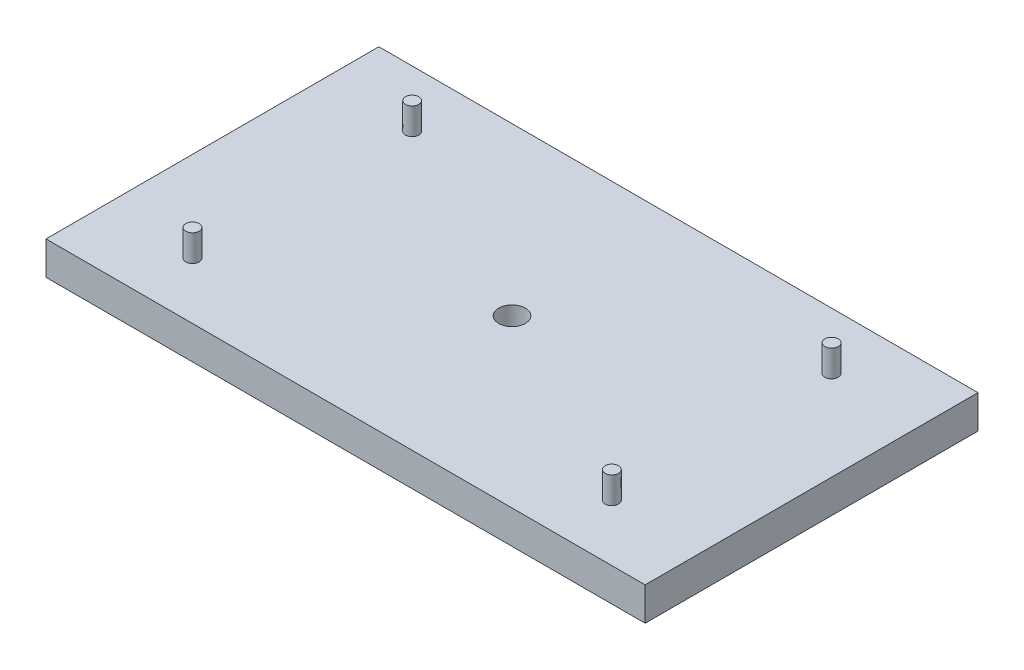
ISO-10303-21;
HEADER;
FILE_DESCRIPTION(('STEP AP214'),'2;1');
FILE_NAME('part.step','',(''),(''),'','','');
FILE_SCHEMA(('AUTOMOTIVE_DESIGN { 1 0 10303 214 1 1 1 1 }'));
ENDSEC;
DATA;
#1=APPLICATION_CONTEXT('core data for automotive mechanical design processes');
#2=APPLICATION_PROTOCOL_DEFINITION('international standard','automotive_design',2000,#1);
#3=PRODUCT_CONTEXT('',#1,'mechanical');
#4=PRODUCT('Part','Part','',(#3));
#5=PRODUCT_RELATED_PRODUCT_CATEGORY('part','',(#4));
#6=PRODUCT_DEFINITION_FORMATION('','',#4);
#7=PRODUCT_DEFINITION_CONTEXT('part definition',#1,'design');
#8=PRODUCT_DEFINITION('design','',#6,#7);
#9=PRODUCT_DEFINITION_SHAPE('','',#8);
#10=(LENGTH_UNIT() NAMED_UNIT(*) SI_UNIT(.MILLI.,.METRE.));
#11=(NAMED_UNIT(*) PLANE_ANGLE_UNIT() SI_UNIT($,.RADIAN.));
#12=(NAMED_UNIT(*) SI_UNIT($,.STERADIAN.) SOLID_ANGLE_UNIT());
#13=UNCERTAINTY_MEASURE_WITH_UNIT(LENGTH_MEASURE(1.E-05),#10,'distance_accuracy_value','');
#14=(GEOMETRIC_REPRESENTATION_CONTEXT(3) GLOBAL_UNCERTAINTY_ASSIGNED_CONTEXT((#13)) GLOBAL_UNIT_ASSIGNED_CONTEXT((#10,
#11,#12)) REPRESENTATION_CONTEXT('',''));
#15=CARTESIAN_POINT('',(0.,0.,0.));
#16=DIRECTION('',(0.,0.,1.));
#17=DIRECTION('',(1.,0.,0.));
#18=AXIS2_PLACEMENT_3D('',#15,#16,#17);
#19=CARTESIAN_POINT('',(-68.5629921259842,5.,-63.9566929133858));
#20=DIRECTION('',(-1.,0.,0.));
#21=DIRECTION('',(0.,0.,1.));
#22=AXIS2_PLACEMENT_3D('',#19,#20,#21);
#23=PLANE('',#22);
#24=DIRECTION('',(0.,0.,-1.));
#25=VECTOR('',#24,1.);
#26=CARTESIAN_POINT('',(-68.5629921259842,0.,-63.9566929133858));
#27=LINE('',#26,#25);
#28=CARTESIAN_POINT('',(-68.5629921259842,0.,-13.9566929133858));
#29=VERTEX_POINT('',#28);
#30=CARTESIAN_POINT('',(-68.5629921259842,0.,-63.9566929133858));
#31=VERTEX_POINT('',#30);
#32=EDGE_CURVE('E102',#29,#31,#27,.T.);
#33=ORIENTED_EDGE('',*,*,#32,.T.);
#34=DIRECTION('',(0.,-1.,0.));
#35=VECTOR('',#34,1.);
#36=CARTESIAN_POINT('',(-68.5629921259842,5.,-63.9566929133858));
#37=LINE('',#36,#35);
#38=CARTESIAN_POINT('',(-68.5629921259842,5.,-63.9566929133858));
#39=VERTEX_POINT('',#38);
#40=EDGE_CURVE('E11',#39,#31,#37,.T.);
#41=ORIENTED_EDGE('',*,*,#40,.F.);
#42=DIRECTION('',(0.,0.,-1.));
#43=VECTOR('',#42,1.);
#44=CARTESIAN_POINT('',(-68.5629921259842,5.,-63.9566929133858));
#45=LINE('',#44,#43);
#46=CARTESIAN_POINT('',(-68.5629921259842,5.,-13.9566929133858));
#47=VERTEX_POINT('',#46);
#48=EDGE_CURVE('E90',#47,#39,#45,.T.);
#49=ORIENTED_EDGE('',*,*,#48,.F.);
#50=DIRECTION('',(0.,-1.,0.));
#51=VECTOR('',#50,1.);
#52=CARTESIAN_POINT('',(-68.5629921259842,5.,-13.9566929133858));
#53=LINE('',#52,#51);
#54=EDGE_CURVE('E98',#47,#29,#53,.T.);
#55=ORIENTED_EDGE('',*,*,#54,.T.);
#56=EDGE_LOOP('',(#33,#41,#49,#55));
#57=FACE_BOUND('',#56,.T.);
#58=ADVANCED_FACE('F39',(#57),#23,.F.);
#59=CARTESIAN_POINT('',(-158.562992125984,5.,-63.9566929133858));
#60=DIRECTION('',(0.,0.,1.));
#61=DIRECTION('',(1.,0.,0.));
#62=AXIS2_PLACEMENT_3D('',#59,#60,#61);
#63=PLANE('',#62);
#64=DIRECTION('',(-1.,0.,0.));
#65=VECTOR('',#64,1.);
#66=CARTESIAN_POINT('',(-158.562992125984,0.,-63.9566929133858));
#67=LINE('',#66,#65);
#68=CARTESIAN_POINT('',(-158.562992125984,0.,-63.9566929133858));
#69=VERTEX_POINT('',#68);
#70=EDGE_CURVE('E94',#31,#69,#67,.T.);
#71=ORIENTED_EDGE('',*,*,#70,.T.);
#72=DIRECTION('',(0.,-1.,0.));
#73=VECTOR('',#72,1.);
#74=CARTESIAN_POINT('',(-158.562992125984,5.,-63.9566929133858));
#75=LINE('',#74,#73);
#76=CARTESIAN_POINT('',(-158.562992125984,5.,-63.9566929133858));
#77=VERTEX_POINT('',#76);
#78=EDGE_CURVE('E47',#77,#69,#75,.T.);
#79=ORIENTED_EDGE('',*,*,#78,.F.);
#80=DIRECTION('',(-1.,0.,0.));
#81=VECTOR('',#80,1.);
#82=CARTESIAN_POINT('',(-158.562992125984,5.,-63.9566929133858));
#83=LINE('',#82,#81);
#84=EDGE_CURVE('E85',#39,#77,#83,.T.);
#85=ORIENTED_EDGE('',*,*,#84,.F.);
#86=ORIENTED_EDGE('',*,*,#40,.T.);
#87=EDGE_LOOP('',(#71,#79,#85,#86));
#88=FACE_BOUND('',#87,.T.);
#89=ADVANCED_FACE('F93',(#88),#63,.F.);
#90=CARTESIAN_POINT('',(-158.562992125984,5.,-63.9566929133858));
#91=DIRECTION('',(1.,0.,0.));
#92=DIRECTION('',(0.,0.,-1.));
#93=AXIS2_PLACEMENT_3D('',#90,#91,#92);
#94=PLANE('',#93);
#95=DIRECTION('',(0.,0.,1.));
#96=VECTOR('',#95,1.);
#97=CARTESIAN_POINT('',(-158.562992125984,0.,-63.9566929133858));
#98=LINE('',#97,#96);
#99=CARTESIAN_POINT('',(-158.562992125984,0.,-13.9566929133858));
#100=VERTEX_POINT('',#99);
#101=EDGE_CURVE('E72',#69,#100,#98,.T.);
#102=ORIENTED_EDGE('',*,*,#101,.T.);
#103=DIRECTION('',(0.,-1.,0.));
#104=VECTOR('',#103,1.);
#105=CARTESIAN_POINT('',(-158.562992125984,5.,-13.9566929133858));
#106=LINE('',#105,#104);
#107=CARTESIAN_POINT('',(-158.562992125984,5.,-13.9566929133858));
#108=VERTEX_POINT('',#107);
#109=EDGE_CURVE('E95',#108,#100,#106,.T.);
#110=ORIENTED_EDGE('',*,*,#109,.F.);
#111=DIRECTION('',(0.,0.,1.));
#112=VECTOR('',#111,1.);
#113=CARTESIAN_POINT('',(-158.562992125984,5.,-63.9566929133858));
#114=LINE('',#113,#112);
#115=EDGE_CURVE('E88',#77,#108,#114,.T.);
#116=ORIENTED_EDGE('',*,*,#115,.F.);
#117=ORIENTED_EDGE('',*,*,#78,.T.);
#118=EDGE_LOOP('',(#102,#110,#116,#117));
#119=FACE_BOUND('',#118,.T.);
#120=ADVANCED_FACE('F96',(#119),#94,.F.);
#121=CARTESIAN_POINT('',(-158.562992125984,5.,-13.9566929133858));
#122=DIRECTION('',(0.,0.,-1.));
#123=DIRECTION('',(-1.,0.,0.));
#124=AXIS2_PLACEMENT_3D('',#121,#122,#123);
#125=PLANE('',#124);
#126=DIRECTION('',(1.,0.,0.));
#127=VECTOR('',#126,1.);
#128=CARTESIAN_POINT('',(-158.562992125984,0.,-13.9566929133858));
#129=LINE('',#128,#127);
#130=EDGE_CURVE('E78',#100,#29,#129,.T.);
#131=ORIENTED_EDGE('',*,*,#130,.T.);
#132=ORIENTED_EDGE('',*,*,#54,.F.);
#133=DIRECTION('',(1.,0.,0.));
#134=VECTOR('',#133,1.);
#135=CARTESIAN_POINT('',(-158.562992125984,5.,-13.9566929133858));
#136=LINE('',#135,#134);
#137=EDGE_CURVE('E55',#108,#47,#136,.T.);
#138=ORIENTED_EDGE('',*,*,#137,.F.);
#139=ORIENTED_EDGE('',*,*,#109,.T.);
#140=EDGE_LOOP('',(#131,#132,#138,#139));
#141=FACE_BOUND('',#140,.T.);
#142=ADVANCED_FACE('F110',(#141),#125,.F.);
#143=CARTESIAN_POINT('',(0.,5.,0.));
#144=DIRECTION('',(0.,1.,0.));
#145=DIRECTION('',(0.,0.,1.));
#146=AXIS2_PLACEMENT_3D('',#143,#144,#145);
#147=PLANE('',#146);
#148=CARTESIAN_POINT('',(-113.562992125984,5.,-38.9566929133858));
#149=DIRECTION('',(0.,1.,0.));
#150=DIRECTION('',(0.,0.,1.));
#151=AXIS2_PLACEMENT_3D('',#148,#149,#150);
#152=CIRCLE('',#151,1.99999999999999);
#153=CARTESIAN_POINT('',(-113.562992125984,5.,-36.9566929133858));
#154=VERTEX_POINT('',#153);
#155=EDGE_CURVE('E137',#154,#154,#152,.T.);
#156=ORIENTED_EDGE('',*,*,#155,.F.);
#157=EDGE_LOOP('',(#156));
#158=FACE_BOUND('',#157,.T.);
#159=CARTESIAN_POINT('',(-82.0629921259842,5.,-22.4566929133853));
#160=DIRECTION('',(0.,1.,0.));
#161=DIRECTION('',(0.,0.,1.));
#162=AXIS2_PLACEMENT_3D('',#159,#160,#161);
#163=CIRCLE('',#162,0.999999999999998);
#164=CARTESIAN_POINT('',(-82.0629921259842,5.,-21.4566929133853));
#165=VERTEX_POINT('',#164);
#166=EDGE_CURVE('E131',#165,#165,#163,.T.);
#167=ORIENTED_EDGE('',*,*,#166,.F.);
#168=EDGE_LOOP('',(#167));
#169=FACE_BOUND('',#168,.T.);
#170=CARTESIAN_POINT('',(-82.0629921259842,5.,-55.4566929133858));
#171=DIRECTION('',(0.,1.,0.));
#172=DIRECTION('',(0.,0.,1.));
#173=AXIS2_PLACEMENT_3D('',#170,#171,#172);
#174=CIRCLE('',#173,0.999999999999998);
#175=CARTESIAN_POINT('',(-82.0629921259842,5.,-54.4566929133858));
#176=VERTEX_POINT('',#175);
#177=EDGE_CURVE('E125',#176,#176,#174,.T.);
#178=ORIENTED_EDGE('',*,*,#177,.F.);
#179=EDGE_LOOP('',(#178));
#180=FACE_BOUND('',#179,.T.);
#181=CARTESIAN_POINT('',(-145.062992125984,5.,-55.4566929133858));
#182=DIRECTION('',(0.,1.,0.));
#183=DIRECTION('',(0.,0.,1.));
#184=AXIS2_PLACEMENT_3D('',#181,#182,#183);
#185=CIRCLE('',#184,0.999999999999998);
#186=CARTESIAN_POINT('',(-145.062992125984,5.,-54.4566929133858));
#187=VERTEX_POINT('',#186);
#188=EDGE_CURVE('E119',#187,#187,#185,.T.);
#189=ORIENTED_EDGE('',*,*,#188,.F.);
#190=EDGE_LOOP('',(#189));
#191=FACE_BOUND('',#190,.T.);
#192=CARTESIAN_POINT('',(-145.062992125984,5.,-22.4566929133858));
#193=DIRECTION('',(0.,1.,0.));
#194=DIRECTION('',(0.,0.,1.));
#195=AXIS2_PLACEMENT_3D('',#192,#193,#194);
#196=CIRCLE('',#195,0.999999999999998);
#197=CARTESIAN_POINT('',(-145.062992125984,5.,-21.4566929133858));
#198=VERTEX_POINT('',#197);
#199=EDGE_CURVE('E116',#198,#198,#196,.T.);
#200=ORIENTED_EDGE('',*,*,#199,.F.);
#201=EDGE_LOOP('',(#200));
#202=FACE_BOUND('',#201,.T.);
#203=ORIENTED_EDGE('',*,*,#48,.T.);
#204=ORIENTED_EDGE('',*,*,#84,.T.);
#205=ORIENTED_EDGE('',*,*,#115,.T.);
#206=ORIENTED_EDGE('',*,*,#137,.T.);
#207=EDGE_LOOP('',(#203,#204,#205,#206));
#208=FACE_BOUND('',#207,.T.);
#209=ADVANCED_FACE('F86',(#158,#169,#180,#191,#202,#208),#147,.T.);
#210=CARTESIAN_POINT('',(0.,0.,0.));
#211=DIRECTION('',(0.,1.,0.));
#212=DIRECTION('',(0.,0.,1.));
#213=AXIS2_PLACEMENT_3D('',#210,#211,#212);
#214=PLANE('',#213);
#215=CARTESIAN_POINT('',(-113.562992125984,0.,-38.9566929133858));
#216=DIRECTION('',(0.,-1.,0.));
#217=DIRECTION('',(0.,0.,-1.));
#218=AXIS2_PLACEMENT_3D('',#215,#216,#217);
#219=CIRCLE('',#218,1.99999999999999);
#220=CARTESIAN_POINT('',(-113.562992125984,0.,-40.9566929133858));
#221=VERTEX_POINT('',#220);
#222=EDGE_CURVE('E142',#221,#221,#219,.T.);
#223=ORIENTED_EDGE('',*,*,#222,.F.);
#224=EDGE_LOOP('',(#223));
#225=FACE_BOUND('',#224,.T.);
#226=ORIENTED_EDGE('',*,*,#32,.F.);
#227=ORIENTED_EDGE('',*,*,#130,.F.);
#228=ORIENTED_EDGE('',*,*,#101,.F.);
#229=ORIENTED_EDGE('',*,*,#70,.F.);
#230=EDGE_LOOP('',(#226,#227,#228,#229));
#231=FACE_BOUND('',#230,.T.);
#232=ADVANCED_FACE('F113',(#225,#231),#214,.F.);
#233=CARTESIAN_POINT('',(-145.062992125984,9.,-22.4566929133858));
#234=DIRECTION('',(0.,-1.,0.));
#235=DIRECTION('',(0.,0.,-1.));
#236=AXIS2_PLACEMENT_3D('',#233,#234,#235);
#237=CYLINDRICAL_SURFACE('',#236,0.999999999999998);
#238=CARTESIAN_POINT('',(-145.062992125984,9.,-22.4566929133858));
#239=DIRECTION('',(0.,1.,0.));
#240=DIRECTION('',(0.,0.,1.));
#241=AXIS2_PLACEMENT_3D('',#238,#239,#240);
#242=CIRCLE('',#241,0.999999999999998);
#243=CARTESIAN_POINT('',(-145.062992125984,9.,-21.4566929133858));
#244=VERTEX_POINT('',#243);
#245=EDGE_CURVE('E105',#244,#244,#242,.T.);
#246=ORIENTED_EDGE('',*,*,#245,.F.);
#247=EDGE_LOOP('',(#246));
#248=FACE_BOUND('',#247,.T.);
#249=ORIENTED_EDGE('',*,*,#199,.T.);
#250=EDGE_LOOP('',(#249));
#251=FACE_BOUND('',#250,.T.);
#252=ADVANCED_FACE('F149',(#248,#251),#237,.T.);
#253=CARTESIAN_POINT('',(-145.062992125984,9.,-22.4566929133858));
#254=DIRECTION('',(0.,1.,0.));
#255=DIRECTION('',(0.,0.,1.));
#256=AXIS2_PLACEMENT_3D('',#253,#254,#255);
#257=PLANE('',#256);
#258=ORIENTED_EDGE('',*,*,#245,.T.);
#259=EDGE_LOOP('',(#258));
#260=FACE_BOUND('',#259,.T.);
#261=ADVANCED_FACE('F156',(#260),#257,.T.);
#262=CARTESIAN_POINT('',(-145.062992125984,9.,-55.4566929133858));
#263=DIRECTION('',(0.,-1.,0.));
#264=DIRECTION('',(0.,0.,-1.));
#265=AXIS2_PLACEMENT_3D('',#262,#263,#264);
#266=CYLINDRICAL_SURFACE('',#265,0.999999999999998);
#267=CARTESIAN_POINT('',(-145.062992125984,9.,-55.4566929133858));
#268=DIRECTION('',(0.,1.,0.));
#269=DIRECTION('',(0.,0.,1.));
#270=AXIS2_PLACEMENT_3D('',#267,#268,#269);
#271=CIRCLE('',#270,0.999999999999998);
#272=CARTESIAN_POINT('',(-145.062992125984,9.,-54.4566929133858));
#273=VERTEX_POINT('',#272);
#274=EDGE_CURVE('E122',#273,#273,#271,.T.);
#275=ORIENTED_EDGE('',*,*,#274,.F.);
#276=EDGE_LOOP('',(#275));
#277=FACE_BOUND('',#276,.T.);
#278=ORIENTED_EDGE('',*,*,#188,.T.);
#279=EDGE_LOOP('',(#278));
#280=FACE_BOUND('',#279,.T.);
#281=ADVANCED_FACE('F188',(#277,#280),#266,.T.);
#282=CARTESIAN_POINT('',(-145.062992125984,9.,-55.4566929133858));
#283=DIRECTION('',(0.,1.,0.));
#284=DIRECTION('',(0.,0.,1.));
#285=AXIS2_PLACEMENT_3D('',#282,#283,#284);
#286=PLANE('',#285);
#287=ORIENTED_EDGE('',*,*,#274,.T.);
#288=EDGE_LOOP('',(#287));
#289=FACE_BOUND('',#288,.T.);
#290=ADVANCED_FACE('F197',(#289),#286,.T.);
#291=CARTESIAN_POINT('',(-82.0629921259842,9.,-55.4566929133858));
#292=DIRECTION('',(0.,-1.,0.));
#293=DIRECTION('',(0.,0.,-1.));
#294=AXIS2_PLACEMENT_3D('',#291,#292,#293);
#295=CYLINDRICAL_SURFACE('',#294,0.999999999999998);
#296=CARTESIAN_POINT('',(-82.0629921259842,9.,-55.4566929133858));
#297=DIRECTION('',(0.,1.,0.));
#298=DIRECTION('',(0.,0.,1.));
#299=AXIS2_PLACEMENT_3D('',#296,#297,#298);
#300=CIRCLE('',#299,0.999999999999998);
#301=CARTESIAN_POINT('',(-82.0629921259842,9.,-54.4566929133858));
#302=VERTEX_POINT('',#301);
#303=EDGE_CURVE('E128',#302,#302,#300,.T.);
#304=ORIENTED_EDGE('',*,*,#303,.F.);
#305=EDGE_LOOP('',(#304));
#306=FACE_BOUND('',#305,.T.);
#307=ORIENTED_EDGE('',*,*,#177,.T.);
#308=EDGE_LOOP('',(#307));
#309=FACE_BOUND('',#308,.T.);
#310=ADVANCED_FACE('F206',(#306,#309),#295,.T.);
#311=CARTESIAN_POINT('',(-82.0629921259842,9.,-55.4566929133858));
#312=DIRECTION('',(0.,1.,0.));
#313=DIRECTION('',(0.,0.,1.));
#314=AXIS2_PLACEMENT_3D('',#311,#312,#313);
#315=PLANE('',#314);
#316=ORIENTED_EDGE('',*,*,#303,.T.);
#317=EDGE_LOOP('',(#316));
#318=FACE_BOUND('',#317,.T.);
#319=ADVANCED_FACE('F215',(#318),#315,.T.);
#320=CARTESIAN_POINT('',(-82.0629921259842,9.,-22.4566929133853));
#321=DIRECTION('',(0.,-1.,0.));
#322=DIRECTION('',(0.,0.,-1.));
#323=AXIS2_PLACEMENT_3D('',#320,#321,#322);
#324=CYLINDRICAL_SURFACE('',#323,0.999999999999998);
#325=CARTESIAN_POINT('',(-82.0629921259842,9.,-22.4566929133853));
#326=DIRECTION('',(0.,1.,0.));
#327=DIRECTION('',(0.,0.,1.));
#328=AXIS2_PLACEMENT_3D('',#325,#326,#327);
#329=CIRCLE('',#328,0.999999999999998);
#330=CARTESIAN_POINT('',(-82.0629921259842,9.,-21.4566929133853));
#331=VERTEX_POINT('',#330);
#332=EDGE_CURVE('E134',#331,#331,#329,.T.);
#333=ORIENTED_EDGE('',*,*,#332,.F.);
#334=EDGE_LOOP('',(#333));
#335=FACE_BOUND('',#334,.T.);
#336=ORIENTED_EDGE('',*,*,#166,.T.);
#337=EDGE_LOOP('',(#336));
#338=FACE_BOUND('',#337,.T.);
#339=ADVANCED_FACE('F224',(#335,#338),#324,.T.);
#340=CARTESIAN_POINT('',(-82.0629921259842,9.,-22.4566929133853));
#341=DIRECTION('',(0.,1.,0.));
#342=DIRECTION('',(0.,0.,1.));
#343=AXIS2_PLACEMENT_3D('',#340,#341,#342);
#344=PLANE('',#343);
#345=ORIENTED_EDGE('',*,*,#332,.T.);
#346=EDGE_LOOP('',(#345));
#347=FACE_BOUND('',#346,.T.);
#348=ADVANCED_FACE('F233',(#347),#344,.T.);
#349=CARTESIAN_POINT('',(-113.562992125984,18.,-38.9566929133858));
#350=DIRECTION('',(0.,-1.,0.));
#351=DIRECTION('',(0.,0.,-1.));
#352=AXIS2_PLACEMENT_3D('',#349,#350,#351);
#353=CYLINDRICAL_SURFACE('',#352,1.99999999999999);
#354=ORIENTED_EDGE('',*,*,#155,.T.);
#355=EDGE_LOOP('',(#354));
#356=FACE_BOUND('',#355,.T.);
#357=ORIENTED_EDGE('',*,*,#222,.T.);
#358=EDGE_LOOP('',(#357));
#359=FACE_BOUND('',#358,.T.);
#360=ADVANCED_FACE('F146',(#356,#359),#353,.F.);
#361=CLOSED_SHELL('',(#58,#89,#120,#142,#209,#232,#252,#261,#281,#290,#310,#319,#339,#348,#360));
#362=MANIFOLD_SOLID_BREP('B2',#361);
#363=ADVANCED_BREP_SHAPE_REPRESENTATION('',(#18,#362),#14);
#364=SHAPE_DEFINITION_REPRESENTATION(#9,#363);
ENDSEC;
END-ISO-10303-21;
